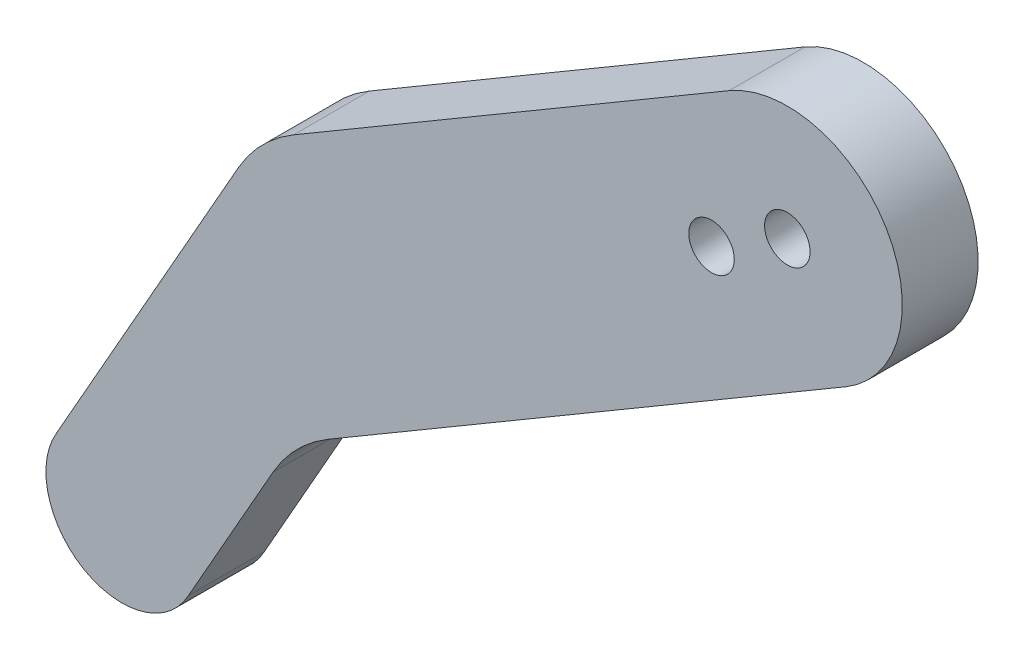
ISO-10303-21;
HEADER;
FILE_DESCRIPTION(('STEP AP214'),'2;1');
FILE_NAME('part.step','',(''),(''),'','','');
FILE_SCHEMA(('AUTOMOTIVE_DESIGN { 1 0 10303 214 1 1 1 1 }'));
ENDSEC;
DATA;
#1=APPLICATION_CONTEXT('core data for automotive mechanical design processes');
#2=APPLICATION_PROTOCOL_DEFINITION('international standard','automotive_design',2000,#1);
#3=PRODUCT_CONTEXT('',#1,'mechanical');
#4=PRODUCT('Part','Part','',(#3));
#5=PRODUCT_RELATED_PRODUCT_CATEGORY('part','',(#4));
#6=PRODUCT_DEFINITION_FORMATION('','',#4);
#7=PRODUCT_DEFINITION_CONTEXT('part definition',#1,'design');
#8=PRODUCT_DEFINITION('design','',#6,#7);
#9=PRODUCT_DEFINITION_SHAPE('','',#8);
#10=(LENGTH_UNIT() NAMED_UNIT(*) SI_UNIT(.MILLI.,.METRE.));
#11=(NAMED_UNIT(*) PLANE_ANGLE_UNIT() SI_UNIT($,.RADIAN.));
#12=(NAMED_UNIT(*) SI_UNIT($,.STERADIAN.) SOLID_ANGLE_UNIT());
#13=UNCERTAINTY_MEASURE_WITH_UNIT(LENGTH_MEASURE(1.E-05),#10,'distance_accuracy_value','');
#14=(GEOMETRIC_REPRESENTATION_CONTEXT(3) GLOBAL_UNCERTAINTY_ASSIGNED_CONTEXT((#13)) GLOBAL_UNIT_ASSIGNED_CONTEXT((#10,
#11,#12)) REPRESENTATION_CONTEXT('',''));
#15=CARTESIAN_POINT('',(0.,0.,0.));
#16=DIRECTION('',(0.,0.,1.));
#17=DIRECTION('',(1.,0.,0.));
#18=AXIS2_PLACEMENT_3D('',#15,#16,#17);
#19=CARTESIAN_POINT('',(8.69918007203384,-4.93196371380907,5.));
#20=DIRECTION('',(-0.869918007203384,0.493196371380907,0.));
#21=DIRECTION('',(-0.493196371380907,-0.869918007203384,0.));
#22=AXIS2_PLACEMENT_3D('',#19,#20,#21);
#23=PLANE('',#22);
#24=DIRECTION('',(0.493196371380907,0.869918007203384,0.));
#25=VECTOR('',#24,1.);
#26=CARTESIAN_POINT('',(8.69918007203384,-4.93196371380907,0.));
#27=LINE('',#26,#25);
#28=CARTESIAN_POINT('',(8.69918007203384,-4.93196371380907,0.));
#29=VERTEX_POINT('',#28);
#30=CARTESIAN_POINT('',(14.2824135771518,4.91595011192392,0.));
#31=VERTEX_POINT('',#30);
#32=EDGE_CURVE('E136',#29,#31,#27,.T.);
#33=ORIENTED_EDGE('',*,*,#32,.T.);
#34=DIRECTION('',(0.,0.,-1.));
#35=VECTOR('',#34,1.);
#36=CARTESIAN_POINT('',(14.2824135771518,4.91595011192392,5.));
#37=LINE('',#36,#35);
#38=CARTESIAN_POINT('',(14.2824135771518,4.91595011192392,5.));
#39=VERTEX_POINT('',#38);
#40=EDGE_CURVE('E11',#39,#31,#37,.T.);
#41=ORIENTED_EDGE('',*,*,#40,.F.);
#42=DIRECTION('',(0.493196371380907,0.869918007203384,0.));
#43=VECTOR('',#42,1.);
#44=CARTESIAN_POINT('',(8.69918007203384,-4.93196371380907,5.));
#45=LINE('',#44,#43);
#46=CARTESIAN_POINT('',(8.69918007203384,-4.93196371380907,5.));
#47=VERTEX_POINT('',#46);
#48=EDGE_CURVE('E155',#47,#39,#45,.T.);
#49=ORIENTED_EDGE('',*,*,#48,.F.);
#50=DIRECTION('',(0.,0.,-1.));
#51=VECTOR('',#50,1.);
#52=CARTESIAN_POINT('',(8.69918007203384,-4.93196371380907,5.));
#53=LINE('',#52,#51);
#54=EDGE_CURVE('E132',#47,#29,#53,.T.);
#55=ORIENTED_EDGE('',*,*,#54,.T.);
#56=EDGE_LOOP('',(#33,#41,#49,#55));
#57=FACE_BOUND('',#56,.T.);
#58=ADVANCED_FACE('F39',(#57),#23,.F.);
#59=CARTESIAN_POINT('',(22.9815936491856,-0.0160136018851533,5.));
#60=DIRECTION('',(0.,0.,-1.));
#61=DIRECTION('',(-1.,0.,0.));
#62=AXIS2_PLACEMENT_3D('',#59,#60,#61);
#63=CYLINDRICAL_SURFACE('',#62,10.);
#64=CARTESIAN_POINT('',(22.9815936491856,-0.0160136018851533,0.));
#65=DIRECTION('',(0.,0.,1.));
#66=DIRECTION('',(1.,0.,0.));
#67=AXIS2_PLACEMENT_3D('',#64,#65,#66);
#68=CIRCLE('',#67,10.);
#69=CARTESIAN_POINT('',(17.9138645716135,8.60478230083347,0.));
#70=VERTEX_POINT('',#69);
#71=EDGE_CURVE('E139',#31,#70,#68,.F.);
#72=ORIENTED_EDGE('',*,*,#71,.T.);
#73=DIRECTION('',(0.,0.,-1.));
#74=VECTOR('',#73,1.);
#75=CARTESIAN_POINT('',(17.9138645716135,8.60478230083347,5.));
#76=LINE('',#75,#74);
#77=CARTESIAN_POINT('',(17.9138645716135,8.60478230083347,5.));
#78=VERTEX_POINT('',#77);
#79=EDGE_CURVE('E48',#78,#70,#76,.T.);
#80=ORIENTED_EDGE('',*,*,#79,.F.);
#81=CARTESIAN_POINT('',(22.9815936491856,-0.0160136018851533,5.));
#82=DIRECTION('',(0.,0.,1.));
#83=DIRECTION('',(1.,0.,0.));
#84=AXIS2_PLACEMENT_3D('',#81,#82,#83);
#85=CIRCLE('',#84,10.);
#86=EDGE_CURVE('E96',#39,#78,#85,.F.);
#87=ORIENTED_EDGE('',*,*,#86,.F.);
#88=ORIENTED_EDGE('',*,*,#40,.T.);
#89=EDGE_LOOP('',(#72,#80,#87,#88));
#90=FACE_BOUND('',#89,.T.);
#91=ADVANCED_FACE('F205',(#90),#63,.F.);
#92=CARTESIAN_POINT('',(0.841371766374037,-1.43127112069207,5.));
#93=DIRECTION('',(-0.50677290775721,0.862079590271863,0.));
#94=DIRECTION('',(-0.862079590271863,-0.50677290775721,0.));
#95=AXIS2_PLACEMENT_3D('',#92,#93,#94);
#96=PLANE('',#95);
#97=DIRECTION('',(0.862079590271863,0.50677290775721,0.));
#98=VECTOR('',#97,1.);
#99=CARTESIAN_POINT('',(0.841371766374037,-1.43127112069207,0.));
#100=LINE('',#99,#98);
#101=CARTESIAN_POINT('',(52.0339732981679,28.6622652843887,0.));
#102=VERTEX_POINT('',#101);
#103=EDGE_CURVE('E142',#70,#102,#100,.T.);
#104=ORIENTED_EDGE('',*,*,#103,.T.);
#105=DIRECTION('',(0.,0.,-1.));
#106=VECTOR('',#105,1.);
#107=CARTESIAN_POINT('',(52.0339732981679,28.6622652843887,5.));
#108=LINE('',#107,#106);
#109=CARTESIAN_POINT('',(52.0339732981679,28.6622652843887,5.));
#110=VERTEX_POINT('',#109);
#111=EDGE_CURVE('E161',#110,#102,#108,.T.);
#112=ORIENTED_EDGE('',*,*,#111,.F.);
#113=DIRECTION('',(0.862079590271863,0.50677290775721,0.));
#114=VECTOR('',#113,1.);
#115=CARTESIAN_POINT('',(0.841371766374037,-1.43127112069207,5.));
#116=LINE('',#115,#114);
#117=EDGE_CURVE('E178',#78,#110,#116,.T.);
#118=ORIENTED_EDGE('',*,*,#117,.F.);
#119=ORIENTED_EDGE('',*,*,#79,.T.);
#120=EDGE_LOOP('',(#104,#112,#118,#119));
#121=FACE_BOUND('',#120,.T.);
#122=ADVANCED_FACE('F209',(#121),#96,.F.);
#123=CARTESIAN_POINT('',(48.1925702876197,35.1969380790698,5.));
#124=DIRECTION('',(0.,0.,-1.));
#125=DIRECTION('',(-1.,0.,0.));
#126=AXIS2_PLACEMENT_3D('',#123,#124,#125);
#127=CYLINDRICAL_SURFACE('',#126,7.58012701892219);
#128=CARTESIAN_POINT('',(48.1925702876197,35.1969380790698,0.));
#129=DIRECTION('',(0.,0.,1.));
#130=DIRECTION('',(1.,0.,0.));
#131=AXIS2_PLACEMENT_3D('',#128,#129,#130);
#132=CIRCLE('',#131,7.58012701892219);
#133=CARTESIAN_POINT('',(44.3511672770715,41.7316108737509,0.));
#134=VERTEX_POINT('',#133);
#135=EDGE_CURVE('E145',#134,#102,#132,.F.);
#136=ORIENTED_EDGE('',*,*,#135,.F.);
#137=DIRECTION('',(0.,0.,-1.));
#138=VECTOR('',#137,1.);
#139=CARTESIAN_POINT('',(44.3511672770715,41.7316108737509,5.));
#140=LINE('',#139,#138);
#141=CARTESIAN_POINT('',(44.3511672770715,41.7316108737509,5.));
#142=VERTEX_POINT('',#141);
#143=EDGE_CURVE('E159',#142,#134,#140,.T.);
#144=ORIENTED_EDGE('',*,*,#143,.F.);
#145=CARTESIAN_POINT('',(48.1925702876197,35.1969380790698,5.));
#146=DIRECTION('',(0.,0.,1.));
#147=DIRECTION('',(1.,0.,0.));
#148=AXIS2_PLACEMENT_3D('',#145,#146,#147);
#149=CIRCLE('',#148,7.58012701892219);
#150=EDGE_CURVE('E180',#142,#110,#149,.F.);
#151=ORIENTED_EDGE('',*,*,#150,.T.);
#152=ORIENTED_EDGE('',*,*,#111,.T.);
#153=EDGE_LOOP('',(#136,#144,#151,#152));
#154=FACE_BOUND('',#153,.T.);
#155=ADVANCED_FACE('F213',(#154),#127,.T.);
#156=CARTESIAN_POINT('',(-6.84143425472235,11.6380744686702,5.));
#157=DIRECTION('',(-0.50677290775721,0.862079590271863,0.));
#158=DIRECTION('',(-0.862079590271863,-0.50677290775721,0.));
#159=AXIS2_PLACEMENT_3D('',#156,#157,#158);
#160=PLANE('',#159);
#161=DIRECTION('',(0.862079590271863,0.50677290775721,0.));
#162=VECTOR('',#161,1.);
#163=CARTESIAN_POINT('',(-6.84143425472235,11.6380744686702,0.));
#164=LINE('',#163,#162);
#165=CARTESIAN_POINT('',(15.6262373275315,24.8456801082865,0.));
#166=VERTEX_POINT('',#165);
#167=EDGE_CURVE('E148',#166,#134,#164,.T.);
#168=ORIENTED_EDGE('',*,*,#167,.F.);
#169=DIRECTION('',(0.,0.,-1.));
#170=VECTOR('',#169,1.);
#171=CARTESIAN_POINT('',(15.6262373275315,24.8456801082865,5.));
#172=LINE('',#171,#170);
#173=CARTESIAN_POINT('',(15.6262373275315,24.8456801082865,5.));
#174=VERTEX_POINT('',#173);
#175=EDGE_CURVE('E121',#174,#166,#172,.T.);
#176=ORIENTED_EDGE('',*,*,#175,.F.);
#177=DIRECTION('',(0.862079590271863,0.50677290775721,0.));
#178=VECTOR('',#177,1.);
#179=CARTESIAN_POINT('',(-6.84143425472235,11.6380744686702,5.));
#180=LINE('',#179,#178);
#181=EDGE_CURVE('E128',#174,#142,#180,.T.);
#182=ORIENTED_EDGE('',*,*,#181,.T.);
#183=ORIENTED_EDGE('',*,*,#143,.T.);
#184=EDGE_LOOP('',(#168,#176,#182,#183));
#185=FACE_BOUND('',#184,.T.);
#186=ADVANCED_FACE('F184',(#185),#160,.T.);
#187=CARTESIAN_POINT('',(20.6939664051036,16.2248842055679,5.));
#188=DIRECTION('',(0.,0.,-1.));
#189=DIRECTION('',(-1.,0.,0.));
#190=AXIS2_PLACEMENT_3D('',#187,#188,#189);
#191=CYLINDRICAL_SURFACE('',#190,10.);
#192=CARTESIAN_POINT('',(20.6939664051036,16.2248842055679,0.));
#193=DIRECTION('',(0.,0.,1.));
#194=DIRECTION('',(1.,0.,0.));
#195=AXIS2_PLACEMENT_3D('',#192,#193,#194);
#196=CIRCLE('',#195,10.);
#197=CARTESIAN_POINT('',(11.9947863330697,21.156847919377,0.));
#198=VERTEX_POINT('',#197);
#199=EDGE_CURVE('E116',#198,#166,#196,.F.);
#200=ORIENTED_EDGE('',*,*,#199,.F.);
#201=DIRECTION('',(0.,0.,-1.));
#202=VECTOR('',#201,1.);
#203=CARTESIAN_POINT('',(11.9947863330697,21.156847919377,5.));
#204=LINE('',#203,#202);
#205=CARTESIAN_POINT('',(11.9947863330697,21.156847919377,5.));
#206=VERTEX_POINT('',#205);
#207=EDGE_CURVE('E111',#206,#198,#204,.T.);
#208=ORIENTED_EDGE('',*,*,#207,.F.);
#209=CARTESIAN_POINT('',(20.6939664051036,16.2248842055679,5.));
#210=DIRECTION('',(0.,0.,1.));
#211=DIRECTION('',(1.,0.,0.));
#212=AXIS2_PLACEMENT_3D('',#209,#210,#211);
#213=CIRCLE('',#212,10.);
#214=EDGE_CURVE('E114',#206,#174,#213,.F.);
#215=ORIENTED_EDGE('',*,*,#214,.T.);
#216=ORIENTED_EDGE('',*,*,#175,.T.);
#217=EDGE_LOOP('',(#200,#208,#215,#216));
#218=FACE_BOUND('',#217,.T.);
#219=ADVANCED_FACE('F113',(#218),#191,.T.);
#220=CARTESIAN_POINT('',(0.,0.,5.));
#221=DIRECTION('',(-0.869918007203384,0.493196371380907,0.));
#222=DIRECTION('',(-0.493196371380907,-0.869918007203384,0.));
#223=AXIS2_PLACEMENT_3D('',#220,#221,#222);
#224=PLANE('',#223);
#225=DIRECTION('',(0.493196371380907,0.869918007203384,0.));
#226=VECTOR('',#225,1.);
#227=CARTESIAN_POINT('',(0.,0.,0.));
#228=LINE('',#227,#226);
#229=CARTESIAN_POINT('',(0.,0.,0.));
#230=VERTEX_POINT('',#229);
#231=EDGE_CURVE('E152',#230,#198,#228,.T.);
#232=ORIENTED_EDGE('',*,*,#231,.F.);
#233=DIRECTION('',(0.,0.,-1.));
#234=VECTOR('',#233,1.);
#235=CARTESIAN_POINT('',(0.,0.,5.));
#236=LINE('',#235,#234);
#237=CARTESIAN_POINT('',(0.,0.,5.));
#238=VERTEX_POINT('',#237);
#239=EDGE_CURVE('E85',#238,#230,#236,.T.);
#240=ORIENTED_EDGE('',*,*,#239,.F.);
#241=DIRECTION('',(0.493196371380907,0.869918007203384,0.));
#242=VECTOR('',#241,1.);
#243=CARTESIAN_POINT('',(0.,0.,5.));
#244=LINE('',#243,#242);
#245=EDGE_CURVE('E125',#238,#206,#244,.T.);
#246=ORIENTED_EDGE('',*,*,#245,.T.);
#247=ORIENTED_EDGE('',*,*,#207,.T.);
#248=EDGE_LOOP('',(#232,#240,#246,#247));
#249=FACE_BOUND('',#248,.T.);
#250=ADVANCED_FACE('F130',(#249),#224,.T.);
#251=CARTESIAN_POINT('',(4.30532765313558,-2.54405348545767,5.));
#252=DIRECTION('',(0.,0.,-1.));
#253=DIRECTION('',(-1.,0.,0.));
#254=AXIS2_PLACEMENT_3D('',#251,#252,#253);
#255=CYLINDRICAL_SURFACE('',#254,5.00080536891042);
#256=CARTESIAN_POINT('',(4.30532765313558,-2.54405348545767,0.));
#257=DIRECTION('',(0.,0.,1.));
#258=DIRECTION('',(1.,0.,0.));
#259=AXIS2_PLACEMENT_3D('',#256,#257,#258);
#260=CIRCLE('',#259,5.00080536891042);
#261=EDGE_CURVE('E88',#230,#29,#260,.T.);
#262=ORIENTED_EDGE('',*,*,#261,.T.);
#263=ORIENTED_EDGE('',*,*,#54,.F.);
#264=CARTESIAN_POINT('',(4.30532765313558,-2.54405348545767,5.));
#265=DIRECTION('',(0.,0.,1.));
#266=DIRECTION('',(1.,0.,0.));
#267=AXIS2_PLACEMENT_3D('',#264,#265,#266);
#268=CIRCLE('',#267,5.00080536891042);
#269=EDGE_CURVE('E57',#238,#47,#268,.T.);
#270=ORIENTED_EDGE('',*,*,#269,.F.);
#271=ORIENTED_EDGE('',*,*,#239,.T.);
#272=EDGE_LOOP('',(#262,#263,#270,#271));
#273=FACE_BOUND('',#272,.T.);
#274=ADVANCED_FACE('F193',(#273),#255,.T.);
#275=CARTESIAN_POINT('',(0.,0.,5.));
#276=DIRECTION('',(0.,0.,1.));
#277=DIRECTION('',(1.,0.,0.));
#278=AXIS2_PLACEMENT_3D('',#275,#276,#277);
#279=PLANE('',#278);
#280=CARTESIAN_POINT('',(43.1925702876197,32.2576914394562,5.));
#281=DIRECTION('',(0.,0.,1.));
#282=DIRECTION('',(1.,0.,0.));
#283=AXIS2_PLACEMENT_3D('',#280,#281,#282);
#284=CIRCLE('',#283,1.5);
#285=CARTESIAN_POINT('',(44.6925702876197,32.2576914394562,5.));
#286=VERTEX_POINT('',#285);
#287=EDGE_CURVE('E173',#286,#286,#284,.T.);
#288=ORIENTED_EDGE('',*,*,#287,.F.);
#289=EDGE_LOOP('',(#288));
#290=FACE_BOUND('',#289,.T.);
#291=CARTESIAN_POINT('',(48.1925702876197,35.1969380790698,5.));
#292=DIRECTION('',(0.,0.,1.));
#293=DIRECTION('',(1.,0.,0.));
#294=AXIS2_PLACEMENT_3D('',#291,#292,#293);
#295=CIRCLE('',#294,1.5);
#296=CARTESIAN_POINT('',(49.6925702876197,35.1969380790698,5.));
#297=VERTEX_POINT('',#296);
#298=EDGE_CURVE('E165',#297,#297,#295,.T.);
#299=ORIENTED_EDGE('',*,*,#298,.F.);
#300=EDGE_LOOP('',(#299));
#301=FACE_BOUND('',#300,.T.);
#302=ORIENTED_EDGE('',*,*,#48,.T.);
#303=ORIENTED_EDGE('',*,*,#86,.T.);
#304=ORIENTED_EDGE('',*,*,#117,.T.);
#305=ORIENTED_EDGE('',*,*,#150,.F.);
#306=ORIENTED_EDGE('',*,*,#181,.F.);
#307=ORIENTED_EDGE('',*,*,#214,.F.);
#308=ORIENTED_EDGE('',*,*,#245,.F.);
#309=ORIENTED_EDGE('',*,*,#269,.T.);
#310=EDGE_LOOP('',(#302,#303,#304,#305,#306,#307,#308,#309));
#311=FACE_BOUND('',#310,.T.);
#312=ADVANCED_FACE('F124',(#290,#301,#311),#279,.T.);
#313=CARTESIAN_POINT('',(0.,0.,0.));
#314=DIRECTION('',(0.,0.,1.));
#315=DIRECTION('',(1.,0.,0.));
#316=AXIS2_PLACEMENT_3D('',#313,#314,#315);
#317=PLANE('',#316);
#318=CARTESIAN_POINT('',(43.1925702876197,32.2576914394562,0.));
#319=DIRECTION('',(0.,0.,1.));
#320=DIRECTION('',(1.,0.,0.));
#321=AXIS2_PLACEMENT_3D('',#318,#319,#320);
#322=CIRCLE('',#321,1.5);
#323=CARTESIAN_POINT('',(44.6925702876197,32.2576914394562,0.));
#324=VERTEX_POINT('',#323);
#325=EDGE_CURVE('E42',#324,#324,#322,.T.);
#326=ORIENTED_EDGE('',*,*,#325,.T.);
#327=EDGE_LOOP('',(#326));
#328=FACE_BOUND('',#327,.T.);
#329=CARTESIAN_POINT('',(48.1925702876197,35.1969380790698,0.));
#330=DIRECTION('',(0.,0.,1.));
#331=DIRECTION('',(1.,0.,0.));
#332=AXIS2_PLACEMENT_3D('',#329,#330,#331);
#333=CIRCLE('',#332,1.5);
#334=CARTESIAN_POINT('',(49.6925702876197,35.1969380790698,0.));
#335=VERTEX_POINT('',#334);
#336=EDGE_CURVE('E140',#335,#335,#333,.T.);
#337=ORIENTED_EDGE('',*,*,#336,.T.);
#338=EDGE_LOOP('',(#337));
#339=FACE_BOUND('',#338,.T.);
#340=ORIENTED_EDGE('',*,*,#32,.F.);
#341=ORIENTED_EDGE('',*,*,#261,.F.);
#342=ORIENTED_EDGE('',*,*,#231,.T.);
#343=ORIENTED_EDGE('',*,*,#199,.T.);
#344=ORIENTED_EDGE('',*,*,#167,.T.);
#345=ORIENTED_EDGE('',*,*,#135,.T.);
#346=ORIENTED_EDGE('',*,*,#103,.F.);
#347=ORIENTED_EDGE('',*,*,#71,.F.);
#348=EDGE_LOOP('',(#340,#341,#342,#343,#344,#345,#346,#347));
#349=FACE_BOUND('',#348,.T.);
#350=ADVANCED_FACE('F188',(#328,#339,#349),#317,.F.);
#351=CARTESIAN_POINT('',(48.1925702876197,35.1969380790698,-2.));
#352=DIRECTION('',(0.,0.,1.));
#353=DIRECTION('',(1.,0.,0.));
#354=AXIS2_PLACEMENT_3D('',#351,#352,#353);
#355=CYLINDRICAL_SURFACE('',#354,1.5);
#356=ORIENTED_EDGE('',*,*,#298,.T.);
#357=EDGE_LOOP('',(#356));
#358=FACE_BOUND('',#357,.T.);
#359=ORIENTED_EDGE('',*,*,#336,.F.);
#360=EDGE_LOOP('',(#359));
#361=FACE_BOUND('',#360,.T.);
#362=ADVANCED_FACE('F250',(#358,#361),#355,.F.);
#363=CARTESIAN_POINT('',(43.1925702876197,32.2576914394562,-2.));
#364=DIRECTION('',(0.,0.,1.));
#365=DIRECTION('',(1.,0.,0.));
#366=AXIS2_PLACEMENT_3D('',#363,#364,#365);
#367=CYLINDRICAL_SURFACE('',#366,1.5);
#368=ORIENTED_EDGE('',*,*,#287,.T.);
#369=EDGE_LOOP('',(#368));
#370=FACE_BOUND('',#369,.T.);
#371=ORIENTED_EDGE('',*,*,#325,.F.);
#372=EDGE_LOOP('',(#371));
#373=FACE_BOUND('',#372,.T.);
#374=ADVANCED_FACE('F259',(#370,#373),#367,.F.);
#375=CLOSED_SHELL('',(#58,#91,#122,#155,#186,#219,#250,#274,#312,#350,#362,#374));
#376=MANIFOLD_SOLID_BREP('B2',#375);
#377=ADVANCED_BREP_SHAPE_REPRESENTATION('',(#18,#376),#14);
#378=SHAPE_DEFINITION_REPRESENTATION(#9,#377);
ENDSEC;
END-ISO-10303-21;
